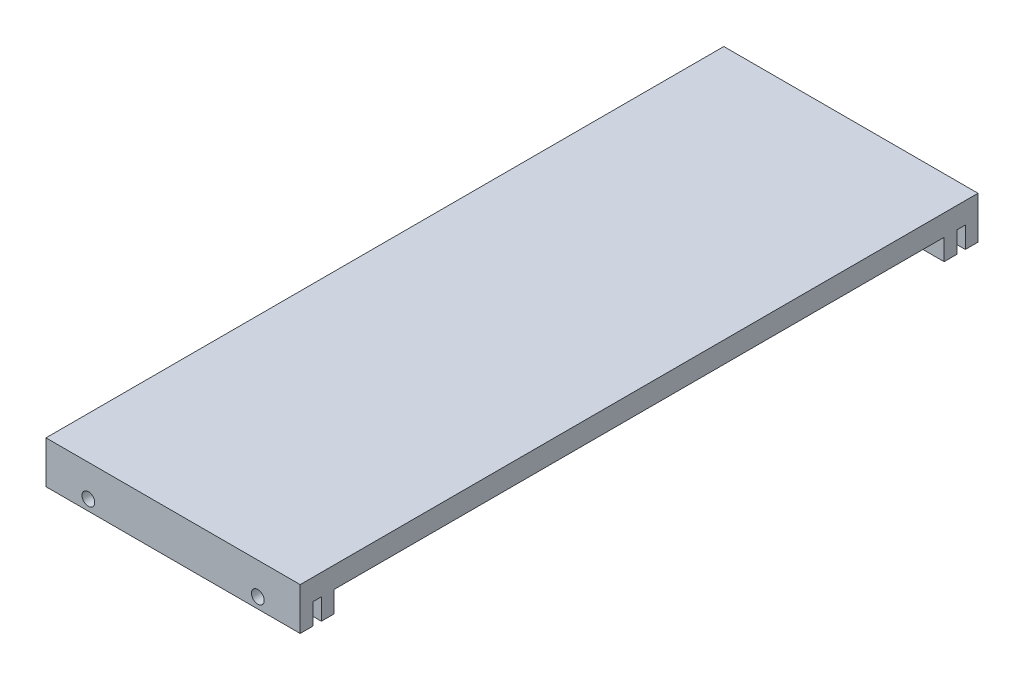
ISO-10303-21;
HEADER;
FILE_DESCRIPTION(('STEP AP214'),'2;1');
FILE_NAME('part.step','',(''),(''),'','','');
FILE_SCHEMA(('AUTOMOTIVE_DESIGN { 1 0 10303 214 1 1 1 1 }'));
ENDSEC;
DATA;
#1=APPLICATION_CONTEXT('core data for automotive mechanical design processes');
#2=APPLICATION_PROTOCOL_DEFINITION('international standard','automotive_design',2000,#1);
#3=PRODUCT_CONTEXT('',#1,'mechanical');
#4=PRODUCT('Part','Part','',(#3));
#5=PRODUCT_RELATED_PRODUCT_CATEGORY('part','',(#4));
#6=PRODUCT_DEFINITION_FORMATION('','',#4);
#7=PRODUCT_DEFINITION_CONTEXT('part definition',#1,'design');
#8=PRODUCT_DEFINITION('design','',#6,#7);
#9=PRODUCT_DEFINITION_SHAPE('','',#8);
#10=(LENGTH_UNIT() NAMED_UNIT(*) SI_UNIT(.MILLI.,.METRE.));
#11=(NAMED_UNIT(*) PLANE_ANGLE_UNIT() SI_UNIT($,.RADIAN.));
#12=(NAMED_UNIT(*) SI_UNIT($,.STERADIAN.) SOLID_ANGLE_UNIT());
#13=UNCERTAINTY_MEASURE_WITH_UNIT(LENGTH_MEASURE(1.E-05),#10,'distance_accuracy_value','');
#14=(GEOMETRIC_REPRESENTATION_CONTEXT(3) GLOBAL_UNCERTAINTY_ASSIGNED_CONTEXT((#13)) GLOBAL_UNIT_ASSIGNED_CONTEXT((#10,
#11,#12)) REPRESENTATION_CONTEXT('',''));
#15=CARTESIAN_POINT('',(0.,0.,0.));
#16=DIRECTION('',(0.,0.,1.));
#17=DIRECTION('',(1.,0.,0.));
#18=AXIS2_PLACEMENT_3D('',#15,#16,#17);
#19=CARTESIAN_POINT('',(300.,-49.9999999999999,-400.));
#20=DIRECTION('',(0.,0.,1.));
#21=DIRECTION('',(1.,0.,0.));
#22=AXIS2_PLACEMENT_3D('',#19,#20,#21);
#23=PLANE('',#22);
#24=CARTESIAN_POINT('',(50.,-37.4999999999999,-400.));
#25=DIRECTION('',(0.,0.,1.));
#26=DIRECTION('',(1.,0.,0.));
#27=AXIS2_PLACEMENT_3D('',#24,#25,#26);
#28=CIRCLE('',#27,7.5);
#29=CARTESIAN_POINT('',(57.5,-37.4999999999999,-400.));
#30=VERTEX_POINT('',#29);
#31=EDGE_CURVE('E249',#30,#30,#28,.T.);
#32=ORIENTED_EDGE('',*,*,#31,.T.);
#33=EDGE_LOOP('',(#32));
#34=FACE_BOUND('',#33,.T.);
#35=CARTESIAN_POINT('',(250.,-37.5,-400.));
#36=DIRECTION('',(0.,0.,1.));
#37=DIRECTION('',(1.,0.,0.));
#38=AXIS2_PLACEMENT_3D('',#35,#36,#37);
#39=CIRCLE('',#38,7.50000000000001);
#40=CARTESIAN_POINT('',(257.5,-37.5,-400.));
#41=VERTEX_POINT('',#40);
#42=EDGE_CURVE('E256',#41,#41,#39,.T.);
#43=ORIENTED_EDGE('',*,*,#42,.T.);
#44=EDGE_LOOP('',(#43));
#45=FACE_BOUND('',#44,.T.);
#46=DIRECTION('',(0.,1.,0.));
#47=VECTOR('',#46,1.);
#48=CARTESIAN_POINT('',(0.,-49.9999999999999,-400.));
#49=LINE('',#48,#47);
#50=CARTESIAN_POINT('',(0.,-49.9999999999999,-400.));
#51=VERTEX_POINT('',#50);
#52=CARTESIAN_POINT('',(0.,0.,-400.));
#53=VERTEX_POINT('',#52);
#54=EDGE_CURVE('E180',#51,#53,#49,.T.);
#55=ORIENTED_EDGE('',*,*,#54,.T.);
#56=DIRECTION('',(-1.,0.,0.));
#57=VECTOR('',#56,1.);
#58=CARTESIAN_POINT('',(300.,0.,-400.));
#59=LINE('',#58,#57);
#60=CARTESIAN_POINT('',(300.,0.,-400.));
#61=VERTEX_POINT('',#60);
#62=EDGE_CURVE('E11',#61,#53,#59,.T.);
#63=ORIENTED_EDGE('',*,*,#62,.F.);
#64=DIRECTION('',(0.,1.,0.));
#65=VECTOR('',#64,1.);
#66=CARTESIAN_POINT('',(300.,-49.9999999999999,-400.));
#67=LINE('',#66,#65);
#68=CARTESIAN_POINT('',(300.,-49.9999999999999,-400.));
#69=VERTEX_POINT('',#68);
#70=EDGE_CURVE('E211',#69,#61,#67,.T.);
#71=ORIENTED_EDGE('',*,*,#70,.F.);
#72=DIRECTION('',(-1.,0.,0.));
#73=VECTOR('',#72,1.);
#74=CARTESIAN_POINT('',(300.,-49.9999999999999,-400.));
#75=LINE('',#74,#73);
#76=EDGE_CURVE('E176',#69,#51,#75,.T.);
#77=ORIENTED_EDGE('',*,*,#76,.T.);
#78=EDGE_LOOP('',(#55,#63,#71,#77));
#79=FACE_BOUND('',#78,.T.);
#80=ADVANCED_FACE('F34',(#34,#45,#79),#23,.F.);
#81=CARTESIAN_POINT('',(300.,0.,400.));
#82=DIRECTION('',(0.,-1.,0.));
#83=DIRECTION('',(0.,0.,-1.));
#84=AXIS2_PLACEMENT_3D('',#81,#82,#83);
#85=PLANE('',#84);
#86=DIRECTION('',(0.,0.,1.));
#87=VECTOR('',#86,1.);
#88=CARTESIAN_POINT('',(0.,0.,400.));
#89=LINE('',#88,#87);
#90=CARTESIAN_POINT('',(0.,0.,400.));
#91=VERTEX_POINT('',#90);
#92=EDGE_CURVE('E183',#53,#91,#89,.T.);
#93=ORIENTED_EDGE('',*,*,#92,.T.);
#94=DIRECTION('',(-1.,0.,0.));
#95=VECTOR('',#94,1.);
#96=CARTESIAN_POINT('',(300.,0.,400.));
#97=LINE('',#96,#95);
#98=CARTESIAN_POINT('',(300.,0.,400.));
#99=VERTEX_POINT('',#98);
#100=EDGE_CURVE('E43',#99,#91,#97,.T.);
#101=ORIENTED_EDGE('',*,*,#100,.F.);
#102=DIRECTION('',(0.,0.,1.));
#103=VECTOR('',#102,1.);
#104=CARTESIAN_POINT('',(300.,0.,400.));
#105=LINE('',#104,#103);
#106=EDGE_CURVE('E119',#61,#99,#105,.T.);
#107=ORIENTED_EDGE('',*,*,#106,.F.);
#108=ORIENTED_EDGE('',*,*,#62,.T.);
#109=EDGE_LOOP('',(#93,#101,#107,#108));
#110=FACE_BOUND('',#109,.T.);
#111=ADVANCED_FACE('F344',(#110),#85,.F.);
#112=CARTESIAN_POINT('',(300.,-50.,400.));
#113=DIRECTION('',(0.,0.,-1.));
#114=DIRECTION('',(-1.,0.,0.));
#115=AXIS2_PLACEMENT_3D('',#112,#113,#114);
#116=PLANE('',#115);
#117=CARTESIAN_POINT('',(50.,-37.4999999999999,400.));
#118=DIRECTION('',(0.,0.,-1.));
#119=DIRECTION('',(-1.,0.,0.));
#120=AXIS2_PLACEMENT_3D('',#117,#118,#119);
#121=CIRCLE('',#120,7.5);
#122=CARTESIAN_POINT('',(42.5,-37.4999999999999,400.));
#123=VERTEX_POINT('',#122);
#124=EDGE_CURVE('E184',#123,#123,#121,.T.);
#125=ORIENTED_EDGE('',*,*,#124,.T.);
#126=EDGE_LOOP('',(#125));
#127=FACE_BOUND('',#126,.T.);
#128=CARTESIAN_POINT('',(250.,-37.5,400.));
#129=DIRECTION('',(0.,0.,-1.));
#130=DIRECTION('',(-1.,0.,0.));
#131=AXIS2_PLACEMENT_3D('',#128,#129,#130);
#132=CIRCLE('',#131,7.50000000000001);
#133=CARTESIAN_POINT('',(242.5,-37.5,400.));
#134=VERTEX_POINT('',#133);
#135=EDGE_CURVE('E274',#134,#134,#132,.T.);
#136=ORIENTED_EDGE('',*,*,#135,.T.);
#137=EDGE_LOOP('',(#136));
#138=FACE_BOUND('',#137,.T.);
#139=DIRECTION('',(0.,-1.,0.));
#140=VECTOR('',#139,1.);
#141=CARTESIAN_POINT('',(0.,-50.,400.));
#142=LINE('',#141,#140);
#143=CARTESIAN_POINT('',(0.,-50.,400.));
#144=VERTEX_POINT('',#143);
#145=EDGE_CURVE('E186',#91,#144,#142,.T.);
#146=ORIENTED_EDGE('',*,*,#145,.T.);
#147=DIRECTION('',(-1.,0.,0.));
#148=VECTOR('',#147,1.);
#149=CARTESIAN_POINT('',(300.,-50.,400.));
#150=LINE('',#149,#148);
#151=CARTESIAN_POINT('',(300.,-50.,400.));
#152=VERTEX_POINT('',#151);
#153=EDGE_CURVE('E242',#152,#144,#150,.T.);
#154=ORIENTED_EDGE('',*,*,#153,.F.);
#155=DIRECTION('',(0.,-1.,0.));
#156=VECTOR('',#155,1.);
#157=CARTESIAN_POINT('',(300.,-50.,400.));
#158=LINE('',#157,#156);
#159=EDGE_CURVE('E296',#99,#152,#158,.T.);
#160=ORIENTED_EDGE('',*,*,#159,.F.);
#161=ORIENTED_EDGE('',*,*,#100,.T.);
#162=EDGE_LOOP('',(#146,#154,#160,#161));
#163=FACE_BOUND('',#162,.T.);
#164=ADVANCED_FACE('F348',(#127,#138,#163),#116,.F.);
#165=CARTESIAN_POINT('',(300.,-50.,385.));
#166=DIRECTION('',(0.,1.,0.));
#167=DIRECTION('',(0.,0.,1.));
#168=AXIS2_PLACEMENT_3D('',#165,#166,#167);
#169=PLANE('',#168);
#170=DIRECTION('',(0.,0.,-1.));
#171=VECTOR('',#170,1.);
#172=CARTESIAN_POINT('',(0.,-50.,385.));
#173=LINE('',#172,#171);
#174=CARTESIAN_POINT('',(0.,-50.,385.));
#175=VERTEX_POINT('',#174);
#176=EDGE_CURVE('E188',#144,#175,#173,.T.);
#177=ORIENTED_EDGE('',*,*,#176,.T.);
#178=DIRECTION('',(-1.,0.,0.));
#179=VECTOR('',#178,1.);
#180=CARTESIAN_POINT('',(300.,-50.,385.));
#181=LINE('',#180,#179);
#182=CARTESIAN_POINT('',(300.,-50.,385.));
#183=VERTEX_POINT('',#182);
#184=EDGE_CURVE('E239',#183,#175,#181,.T.);
#185=ORIENTED_EDGE('',*,*,#184,.F.);
#186=DIRECTION('',(0.,0.,-1.));
#187=VECTOR('',#186,1.);
#188=CARTESIAN_POINT('',(300.,-50.,385.));
#189=LINE('',#188,#187);
#190=EDGE_CURVE('E298',#152,#183,#189,.T.);
#191=ORIENTED_EDGE('',*,*,#190,.F.);
#192=ORIENTED_EDGE('',*,*,#153,.T.);
#193=EDGE_LOOP('',(#177,#185,#191,#192));
#194=FACE_BOUND('',#193,.T.);
#195=ADVANCED_FACE('F427',(#194),#169,.F.);
#196=CARTESIAN_POINT('',(300.,-50.,385.));
#197=DIRECTION('',(0.,0.,1.));
#198=DIRECTION('',(0.,-1.,0.));
#199=AXIS2_PLACEMENT_3D('',#196,#197,#198);
#200=PLANE('',#199);
#201=CARTESIAN_POINT('',(50.,-37.4999999999999,385.));
#202=DIRECTION('',(0.,0.,1.));
#203=DIRECTION('',(0.,-1.,0.));
#204=AXIS2_PLACEMENT_3D('',#201,#202,#203);
#205=CIRCLE('',#204,7.5);
#206=CARTESIAN_POINT('',(50.,-44.9999999999999,385.));
#207=VERTEX_POINT('',#206);
#208=EDGE_CURVE('E289',#207,#207,#205,.T.);
#209=ORIENTED_EDGE('',*,*,#208,.T.);
#210=EDGE_LOOP('',(#209));
#211=FACE_BOUND('',#210,.T.);
#212=CARTESIAN_POINT('',(250.,-37.5,385.));
#213=DIRECTION('',(0.,0.,1.));
#214=DIRECTION('',(0.,-1.,0.));
#215=AXIS2_PLACEMENT_3D('',#212,#213,#214);
#216=CIRCLE('',#215,7.50000000000001);
#217=CARTESIAN_POINT('',(250.,-45.,385.));
#218=VERTEX_POINT('',#217);
#219=EDGE_CURVE('E271',#218,#218,#216,.T.);
#220=ORIENTED_EDGE('',*,*,#219,.T.);
#221=EDGE_LOOP('',(#220));
#222=FACE_BOUND('',#221,.T.);
#223=DIRECTION('',(0.,1.,0.));
#224=VECTOR('',#223,1.);
#225=CARTESIAN_POINT('',(0.,-50.,385.));
#226=LINE('',#225,#224);
#227=CARTESIAN_POINT('',(0.,-25.,385.));
#228=VERTEX_POINT('',#227);
#229=EDGE_CURVE('E190',#175,#228,#226,.T.);
#230=ORIENTED_EDGE('',*,*,#229,.T.);
#231=DIRECTION('',(-1.,0.,0.));
#232=VECTOR('',#231,1.);
#233=CARTESIAN_POINT('',(300.,-25.,385.));
#234=LINE('',#233,#232);
#235=CARTESIAN_POINT('',(300.,-25.,385.));
#236=VERTEX_POINT('',#235);
#237=EDGE_CURVE('E236',#236,#228,#234,.T.);
#238=ORIENTED_EDGE('',*,*,#237,.F.);
#239=DIRECTION('',(0.,1.,0.));
#240=VECTOR('',#239,1.);
#241=CARTESIAN_POINT('',(300.,-50.,385.));
#242=LINE('',#241,#240);
#243=EDGE_CURVE('E300',#183,#236,#242,.T.);
#244=ORIENTED_EDGE('',*,*,#243,.F.);
#245=ORIENTED_EDGE('',*,*,#184,.T.);
#246=EDGE_LOOP('',(#230,#238,#244,#245));
#247=FACE_BOUND('',#246,.T.);
#248=ADVANCED_FACE('F423',(#211,#222,#247),#200,.F.);
#249=CARTESIAN_POINT('',(300.,-25.,385.));
#250=DIRECTION('',(0.,1.,0.));
#251=DIRECTION('',(0.,0.,1.));
#252=AXIS2_PLACEMENT_3D('',#249,#250,#251);
#253=PLANE('',#252);
#254=DIRECTION('',(0.,0.,-1.));
#255=VECTOR('',#254,1.);
#256=CARTESIAN_POINT('',(0.,-25.,385.));
#257=LINE('',#256,#255);
#258=CARTESIAN_POINT('',(0.,-25.,375.));
#259=VERTEX_POINT('',#258);
#260=EDGE_CURVE('E192',#228,#259,#257,.T.);
#261=ORIENTED_EDGE('',*,*,#260,.T.);
#262=DIRECTION('',(-1.,0.,0.));
#263=VECTOR('',#262,1.);
#264=CARTESIAN_POINT('',(300.,-25.,375.));
#265=LINE('',#264,#263);
#266=CARTESIAN_POINT('',(300.,-25.,375.));
#267=VERTEX_POINT('',#266);
#268=EDGE_CURVE('E233',#267,#259,#265,.T.);
#269=ORIENTED_EDGE('',*,*,#268,.F.);
#270=DIRECTION('',(0.,0.,-1.));
#271=VECTOR('',#270,1.);
#272=CARTESIAN_POINT('',(300.,-25.,385.));
#273=LINE('',#272,#271);
#274=EDGE_CURVE('E302',#236,#267,#273,.T.);
#275=ORIENTED_EDGE('',*,*,#274,.F.);
#276=ORIENTED_EDGE('',*,*,#237,.T.);
#277=EDGE_LOOP('',(#261,#269,#275,#276));
#278=FACE_BOUND('',#277,.T.);
#279=ADVANCED_FACE('F393',(#278),#253,.F.);
#280=CARTESIAN_POINT('',(300.,-25.,375.));
#281=DIRECTION('',(0.,0.,-1.));
#282=DIRECTION('',(0.,1.,0.));
#283=AXIS2_PLACEMENT_3D('',#280,#281,#282);
#284=PLANE('',#283);
#285=CARTESIAN_POINT('',(50.,-37.4999999999999,375.));
#286=DIRECTION('',(0.,0.,-1.));
#287=DIRECTION('',(0.,1.,0.));
#288=AXIS2_PLACEMENT_3D('',#285,#286,#287);
#289=CIRCLE('',#288,7.5);
#290=CARTESIAN_POINT('',(50.,-29.9999999999999,375.));
#291=VERTEX_POINT('',#290);
#292=EDGE_CURVE('E286',#291,#291,#289,.T.);
#293=ORIENTED_EDGE('',*,*,#292,.T.);
#294=EDGE_LOOP('',(#293));
#295=FACE_BOUND('',#294,.T.);
#296=CARTESIAN_POINT('',(250.,-37.5,375.));
#297=DIRECTION('',(0.,0.,-1.));
#298=DIRECTION('',(0.,1.,0.));
#299=AXIS2_PLACEMENT_3D('',#296,#297,#298);
#300=CIRCLE('',#299,7.50000000000001);
#301=CARTESIAN_POINT('',(250.,-30.,375.));
#302=VERTEX_POINT('',#301);
#303=EDGE_CURVE('E268',#302,#302,#300,.T.);
#304=ORIENTED_EDGE('',*,*,#303,.T.);
#305=EDGE_LOOP('',(#304));
#306=FACE_BOUND('',#305,.T.);
#307=DIRECTION('',(0.,-1.,0.));
#308=VECTOR('',#307,1.);
#309=CARTESIAN_POINT('',(0.,-25.,375.));
#310=LINE('',#309,#308);
#311=CARTESIAN_POINT('',(0.,-50.,375.));
#312=VERTEX_POINT('',#311);
#313=EDGE_CURVE('E194',#259,#312,#310,.T.);
#314=ORIENTED_EDGE('',*,*,#313,.T.);
#315=DIRECTION('',(-1.,0.,0.));
#316=VECTOR('',#315,1.);
#317=CARTESIAN_POINT('',(300.,-50.,375.));
#318=LINE('',#317,#316);
#319=CARTESIAN_POINT('',(300.,-50.,375.));
#320=VERTEX_POINT('',#319);
#321=EDGE_CURVE('E230',#320,#312,#318,.T.);
#322=ORIENTED_EDGE('',*,*,#321,.F.);
#323=DIRECTION('',(0.,-1.,0.));
#324=VECTOR('',#323,1.);
#325=CARTESIAN_POINT('',(300.,-25.,375.));
#326=LINE('',#325,#324);
#327=EDGE_CURVE('E304',#267,#320,#326,.T.);
#328=ORIENTED_EDGE('',*,*,#327,.F.);
#329=ORIENTED_EDGE('',*,*,#268,.T.);
#330=EDGE_LOOP('',(#314,#322,#328,#329));
#331=FACE_BOUND('',#330,.T.);
#332=ADVANCED_FACE('F389',(#295,#306,#331),#284,.F.);
#333=CARTESIAN_POINT('',(300.,-50.,375.));
#334=DIRECTION('',(0.,1.,0.));
#335=DIRECTION('',(0.,0.,1.));
#336=AXIS2_PLACEMENT_3D('',#333,#334,#335);
#337=PLANE('',#336);
#338=DIRECTION('',(0.,0.,-1.));
#339=VECTOR('',#338,1.);
#340=CARTESIAN_POINT('',(0.,-50.,375.));
#341=LINE('',#340,#339);
#342=CARTESIAN_POINT('',(0.,-50.,360.));
#343=VERTEX_POINT('',#342);
#344=EDGE_CURVE('E196',#312,#343,#341,.T.);
#345=ORIENTED_EDGE('',*,*,#344,.T.);
#346=DIRECTION('',(-1.,0.,0.));
#347=VECTOR('',#346,1.);
#348=CARTESIAN_POINT('',(300.,-50.,360.));
#349=LINE('',#348,#347);
#350=CARTESIAN_POINT('',(300.,-50.,360.));
#351=VERTEX_POINT('',#350);
#352=EDGE_CURVE('E227',#351,#343,#349,.T.);
#353=ORIENTED_EDGE('',*,*,#352,.F.);
#354=DIRECTION('',(0.,0.,-1.));
#355=VECTOR('',#354,1.);
#356=CARTESIAN_POINT('',(300.,-50.,375.));
#357=LINE('',#356,#355);
#358=EDGE_CURVE('E306',#320,#351,#357,.T.);
#359=ORIENTED_EDGE('',*,*,#358,.F.);
#360=ORIENTED_EDGE('',*,*,#321,.T.);
#361=EDGE_LOOP('',(#345,#353,#359,#360));
#362=FACE_BOUND('',#361,.T.);
#363=ADVANCED_FACE('F392',(#362),#337,.F.);
#364=CARTESIAN_POINT('',(300.,-50.,360.));
#365=DIRECTION('',(0.,0.,1.));
#366=DIRECTION('',(1.,0.,0.));
#367=AXIS2_PLACEMENT_3D('',#364,#365,#366);
#368=PLANE('',#367);
#369=CARTESIAN_POINT('',(50.,-37.4999999999999,360.));
#370=DIRECTION('',(0.,0.,1.));
#371=DIRECTION('',(1.,0.,0.));
#372=AXIS2_PLACEMENT_3D('',#369,#370,#371);
#373=CIRCLE('',#372,7.5);
#374=CARTESIAN_POINT('',(57.5,-37.4999999999999,360.));
#375=VERTEX_POINT('',#374);
#376=EDGE_CURVE('E283',#375,#375,#373,.T.);
#377=ORIENTED_EDGE('',*,*,#376,.T.);
#378=EDGE_LOOP('',(#377));
#379=FACE_BOUND('',#378,.T.);
#380=CARTESIAN_POINT('',(250.,-37.5,360.));
#381=DIRECTION('',(0.,0.,1.));
#382=DIRECTION('',(1.,0.,0.));
#383=AXIS2_PLACEMENT_3D('',#380,#381,#382);
#384=CIRCLE('',#383,7.50000000000001);
#385=CARTESIAN_POINT('',(257.5,-37.5,360.));
#386=VERTEX_POINT('',#385);
#387=EDGE_CURVE('E265',#386,#386,#384,.T.);
#388=ORIENTED_EDGE('',*,*,#387,.T.);
#389=EDGE_LOOP('',(#388));
#390=FACE_BOUND('',#389,.T.);
#391=DIRECTION('',(0.,1.,0.));
#392=VECTOR('',#391,1.);
#393=CARTESIAN_POINT('',(0.,-50.,360.));
#394=LINE('',#393,#392);
#395=CARTESIAN_POINT('',(0.,-25.,360.));
#396=VERTEX_POINT('',#395);
#397=EDGE_CURVE('E198',#343,#396,#394,.T.);
#398=ORIENTED_EDGE('',*,*,#397,.T.);
#399=DIRECTION('',(-1.,0.,0.));
#400=VECTOR('',#399,1.);
#401=CARTESIAN_POINT('',(300.,-25.,360.));
#402=LINE('',#401,#400);
#403=CARTESIAN_POINT('',(300.,-25.,360.));
#404=VERTEX_POINT('',#403);
#405=EDGE_CURVE('E224',#404,#396,#402,.T.);
#406=ORIENTED_EDGE('',*,*,#405,.F.);
#407=DIRECTION('',(0.,1.,0.));
#408=VECTOR('',#407,1.);
#409=CARTESIAN_POINT('',(300.,-50.,360.));
#410=LINE('',#409,#408);
#411=EDGE_CURVE('E308',#351,#404,#410,.T.);
#412=ORIENTED_EDGE('',*,*,#411,.F.);
#413=ORIENTED_EDGE('',*,*,#352,.T.);
#414=EDGE_LOOP('',(#398,#406,#412,#413));
#415=FACE_BOUND('',#414,.T.);
#416=ADVANCED_FACE('F410',(#379,#390,#415),#368,.F.);
#417=CARTESIAN_POINT('',(300.,-25.,360.));
#418=DIRECTION('',(0.,1.,0.));
#419=DIRECTION('',(0.,0.,1.));
#420=AXIS2_PLACEMENT_3D('',#417,#418,#419);
#421=PLANE('',#420);
#422=DIRECTION('',(0.,0.,-1.));
#423=VECTOR('',#422,1.);
#424=CARTESIAN_POINT('',(0.,-25.,360.));
#425=LINE('',#424,#423);
#426=CARTESIAN_POINT('',(0.,-25.,-360.));
#427=VERTEX_POINT('',#426);
#428=EDGE_CURVE('E200',#396,#427,#425,.T.);
#429=ORIENTED_EDGE('',*,*,#428,.T.);
#430=DIRECTION('',(-1.,0.,0.));
#431=VECTOR('',#430,1.);
#432=CARTESIAN_POINT('',(300.,-25.,-360.));
#433=LINE('',#432,#431);
#434=CARTESIAN_POINT('',(300.,-25.,-360.));
#435=VERTEX_POINT('',#434);
#436=EDGE_CURVE('E221',#435,#427,#433,.T.);
#437=ORIENTED_EDGE('',*,*,#436,.F.);
#438=DIRECTION('',(0.,0.,-1.));
#439=VECTOR('',#438,1.);
#440=CARTESIAN_POINT('',(300.,-25.,360.));
#441=LINE('',#440,#439);
#442=EDGE_CURVE('E310',#404,#435,#441,.T.);
#443=ORIENTED_EDGE('',*,*,#442,.F.);
#444=ORIENTED_EDGE('',*,*,#405,.T.);
#445=EDGE_LOOP('',(#429,#437,#443,#444));
#446=FACE_BOUND('',#445,.T.);
#447=ADVANCED_FACE('F414',(#446),#421,.F.);
#448=CARTESIAN_POINT('',(300.,-25.,-360.));
#449=DIRECTION('',(0.,0.,-1.));
#450=DIRECTION('',(-1.,0.,0.));
#451=AXIS2_PLACEMENT_3D('',#448,#449,#450);
#452=PLANE('',#451);
#453=CARTESIAN_POINT('',(50.,-37.4999999999999,-360.));
#454=DIRECTION('',(0.,0.,-1.));
#455=DIRECTION('',(-1.,0.,0.));
#456=AXIS2_PLACEMENT_3D('',#453,#454,#455);
#457=CIRCLE('',#456,7.5);
#458=CARTESIAN_POINT('',(42.5,-37.4999999999999,-360.));
#459=VERTEX_POINT('',#458);
#460=EDGE_CURVE('E280',#459,#459,#457,.T.);
#461=ORIENTED_EDGE('',*,*,#460,.T.);
#462=EDGE_LOOP('',(#461));
#463=FACE_BOUND('',#462,.T.);
#464=CARTESIAN_POINT('',(250.,-37.5,-360.));
#465=DIRECTION('',(0.,0.,-1.));
#466=DIRECTION('',(-1.,0.,0.));
#467=AXIS2_PLACEMENT_3D('',#464,#465,#466);
#468=CIRCLE('',#467,7.50000000000001);
#469=CARTESIAN_POINT('',(242.5,-37.5,-360.));
#470=VERTEX_POINT('',#469);
#471=EDGE_CURVE('E253',#470,#470,#468,.T.);
#472=ORIENTED_EDGE('',*,*,#471,.T.);
#473=EDGE_LOOP('',(#472));
#474=FACE_BOUND('',#473,.T.);
#475=DIRECTION('',(0.,-1.,0.));
#476=VECTOR('',#475,1.);
#477=CARTESIAN_POINT('',(0.,-25.,-360.));
#478=LINE('',#477,#476);
#479=CARTESIAN_POINT('',(0.,-50.,-360.));
#480=VERTEX_POINT('',#479);
#481=EDGE_CURVE('E202',#427,#480,#478,.T.);
#482=ORIENTED_EDGE('',*,*,#481,.T.);
#483=DIRECTION('',(-1.,0.,0.));
#484=VECTOR('',#483,1.);
#485=CARTESIAN_POINT('',(300.,-50.,-360.));
#486=LINE('',#485,#484);
#487=CARTESIAN_POINT('',(300.,-50.,-360.));
#488=VERTEX_POINT('',#487);
#489=EDGE_CURVE('E218',#488,#480,#486,.T.);
#490=ORIENTED_EDGE('',*,*,#489,.F.);
#491=DIRECTION('',(0.,-1.,0.));
#492=VECTOR('',#491,1.);
#493=CARTESIAN_POINT('',(300.,-25.,-360.));
#494=LINE('',#493,#492);
#495=EDGE_CURVE('E312',#435,#488,#494,.T.);
#496=ORIENTED_EDGE('',*,*,#495,.F.);
#497=ORIENTED_EDGE('',*,*,#436,.T.);
#498=EDGE_LOOP('',(#482,#490,#496,#497));
#499=FACE_BOUND('',#498,.T.);
#500=ADVANCED_FACE('F452',(#463,#474,#499),#452,.F.);
#501=CARTESIAN_POINT('',(300.,-50.,-360.));
#502=DIRECTION('',(0.,1.,0.));
#503=DIRECTION('',(0.,0.,1.));
#504=AXIS2_PLACEMENT_3D('',#501,#502,#503);
#505=PLANE('',#504);
#506=DIRECTION('',(0.,0.,-1.));
#507=VECTOR('',#506,1.);
#508=CARTESIAN_POINT('',(0.,-50.,-360.));
#509=LINE('',#508,#507);
#510=CARTESIAN_POINT('',(0.,-50.,-375.));
#511=VERTEX_POINT('',#510);
#512=EDGE_CURVE('E204',#480,#511,#509,.T.);
#513=ORIENTED_EDGE('',*,*,#512,.T.);
#514=DIRECTION('',(-1.,0.,0.));
#515=VECTOR('',#514,1.);
#516=CARTESIAN_POINT('',(300.,-50.,-375.));
#517=LINE('',#516,#515);
#518=CARTESIAN_POINT('',(300.,-50.,-375.));
#519=VERTEX_POINT('',#518);
#520=EDGE_CURVE('E215',#519,#511,#517,.T.);
#521=ORIENTED_EDGE('',*,*,#520,.F.);
#522=DIRECTION('',(0.,0.,-1.));
#523=VECTOR('',#522,1.);
#524=CARTESIAN_POINT('',(300.,-50.,-360.));
#525=LINE('',#524,#523);
#526=EDGE_CURVE('E314',#488,#519,#525,.T.);
#527=ORIENTED_EDGE('',*,*,#526,.F.);
#528=ORIENTED_EDGE('',*,*,#489,.T.);
#529=EDGE_LOOP('',(#513,#521,#527,#528));
#530=FACE_BOUND('',#529,.T.);
#531=ADVANCED_FACE('F320',(#530),#505,.F.);
#532=CARTESIAN_POINT('',(300.,-50.,-375.));
#533=DIRECTION('',(0.,0.,1.));
#534=DIRECTION('',(0.,-1.,0.));
#535=AXIS2_PLACEMENT_3D('',#532,#533,#534);
#536=PLANE('',#535);
#537=CARTESIAN_POINT('',(50.,-37.4999999999999,-375.));
#538=DIRECTION('',(0.,0.,1.));
#539=DIRECTION('',(0.,-1.,0.));
#540=AXIS2_PLACEMENT_3D('',#537,#538,#539);
#541=CIRCLE('',#540,7.5);
#542=CARTESIAN_POINT('',(50.,-44.9999999999999,-375.));
#543=VERTEX_POINT('',#542);
#544=EDGE_CURVE('E277',#543,#543,#541,.T.);
#545=ORIENTED_EDGE('',*,*,#544,.T.);
#546=EDGE_LOOP('',(#545));
#547=FACE_BOUND('',#546,.T.);
#548=CARTESIAN_POINT('',(250.,-37.5,-375.));
#549=DIRECTION('',(0.,0.,1.));
#550=DIRECTION('',(0.,-1.,0.));
#551=AXIS2_PLACEMENT_3D('',#548,#549,#550);
#552=CIRCLE('',#551,7.50000000000001);
#553=CARTESIAN_POINT('',(250.,-45.,-375.));
#554=VERTEX_POINT('',#553);
#555=EDGE_CURVE('E248',#554,#554,#552,.T.);
#556=ORIENTED_EDGE('',*,*,#555,.T.);
#557=EDGE_LOOP('',(#556));
#558=FACE_BOUND('',#557,.T.);
#559=DIRECTION('',(0.,1.,0.));
#560=VECTOR('',#559,1.);
#561=CARTESIAN_POINT('',(0.,-50.,-375.));
#562=LINE('',#561,#560);
#563=CARTESIAN_POINT('',(0.,-25.,-375.));
#564=VERTEX_POINT('',#563);
#565=EDGE_CURVE('E206',#511,#564,#562,.T.);
#566=ORIENTED_EDGE('',*,*,#565,.T.);
#567=DIRECTION('',(-1.,0.,0.));
#568=VECTOR('',#567,1.);
#569=CARTESIAN_POINT('',(300.,-25.,-375.));
#570=LINE('',#569,#568);
#571=CARTESIAN_POINT('',(300.,-25.,-375.));
#572=VERTEX_POINT('',#571);
#573=EDGE_CURVE('E171',#572,#564,#570,.T.);
#574=ORIENTED_EDGE('',*,*,#573,.F.);
#575=DIRECTION('',(0.,1.,0.));
#576=VECTOR('',#575,1.);
#577=CARTESIAN_POINT('',(300.,-50.,-375.));
#578=LINE('',#577,#576);
#579=EDGE_CURVE('E162',#519,#572,#578,.T.);
#580=ORIENTED_EDGE('',*,*,#579,.F.);
#581=ORIENTED_EDGE('',*,*,#520,.T.);
#582=EDGE_LOOP('',(#566,#574,#580,#581));
#583=FACE_BOUND('',#582,.T.);
#584=ADVANCED_FACE('F324',(#547,#558,#583),#536,.F.);
#585=CARTESIAN_POINT('',(300.,-25.,-375.));
#586=DIRECTION('',(0.,1.,0.));
#587=DIRECTION('',(0.,0.,1.));
#588=AXIS2_PLACEMENT_3D('',#585,#586,#587);
#589=PLANE('',#588);
#590=DIRECTION('',(0.,0.,-1.));
#591=VECTOR('',#590,1.);
#592=CARTESIAN_POINT('',(0.,-25.,-375.));
#593=LINE('',#592,#591);
#594=CARTESIAN_POINT('',(0.,-25.,-385.));
#595=VERTEX_POINT('',#594);
#596=EDGE_CURVE('E170',#564,#595,#593,.T.);
#597=ORIENTED_EDGE('',*,*,#596,.T.);
#598=DIRECTION('',(-1.,0.,0.));
#599=VECTOR('',#598,1.);
#600=CARTESIAN_POINT('',(300.,-25.,-385.));
#601=LINE('',#600,#599);
#602=CARTESIAN_POINT('',(300.,-25.,-385.));
#603=VERTEX_POINT('',#602);
#604=EDGE_CURVE('E167',#603,#595,#601,.T.);
#605=ORIENTED_EDGE('',*,*,#604,.F.);
#606=DIRECTION('',(0.,0.,-1.));
#607=VECTOR('',#606,1.);
#608=CARTESIAN_POINT('',(300.,-25.,-375.));
#609=LINE('',#608,#607);
#610=EDGE_CURVE('E156',#572,#603,#609,.T.);
#611=ORIENTED_EDGE('',*,*,#610,.F.);
#612=ORIENTED_EDGE('',*,*,#573,.T.);
#613=EDGE_LOOP('',(#597,#605,#611,#612));
#614=FACE_BOUND('',#613,.T.);
#615=ADVANCED_FACE('F168',(#614),#589,.F.);
#616=CARTESIAN_POINT('',(300.,-25.,-385.));
#617=DIRECTION('',(0.,0.,-1.));
#618=DIRECTION('',(0.,1.,0.));
#619=AXIS2_PLACEMENT_3D('',#616,#617,#618);
#620=PLANE('',#619);
#621=CARTESIAN_POINT('',(50.,-37.4999999999999,-385.));
#622=DIRECTION('',(0.,0.,-1.));
#623=DIRECTION('',(0.,1.,0.));
#624=AXIS2_PLACEMENT_3D('',#621,#622,#623);
#625=CIRCLE('',#624,7.5);
#626=CARTESIAN_POINT('',(50.,-29.9999999999999,-385.));
#627=VERTEX_POINT('',#626);
#628=EDGE_CURVE('E37',#627,#627,#625,.T.);
#629=ORIENTED_EDGE('',*,*,#628,.T.);
#630=EDGE_LOOP('',(#629));
#631=FACE_BOUND('',#630,.T.);
#632=CARTESIAN_POINT('',(250.,-37.5,-385.));
#633=DIRECTION('',(0.,0.,-1.));
#634=DIRECTION('',(0.,1.,0.));
#635=AXIS2_PLACEMENT_3D('',#632,#633,#634);
#636=CIRCLE('',#635,7.50000000000001);
#637=CARTESIAN_POINT('',(250.,-30.,-385.));
#638=VERTEX_POINT('',#637);
#639=EDGE_CURVE('E246',#638,#638,#636,.T.);
#640=ORIENTED_EDGE('',*,*,#639,.T.);
#641=EDGE_LOOP('',(#640));
#642=FACE_BOUND('',#641,.T.);
#643=DIRECTION('',(0.,-1.,0.));
#644=VECTOR('',#643,1.);
#645=CARTESIAN_POINT('',(0.,-25.,-385.));
#646=LINE('',#645,#644);
#647=CARTESIAN_POINT('',(0.,-50.,-385.));
#648=VERTEX_POINT('',#647);
#649=EDGE_CURVE('E105',#595,#648,#646,.T.);
#650=ORIENTED_EDGE('',*,*,#649,.T.);
#651=DIRECTION('',(-1.,0.,0.));
#652=VECTOR('',#651,1.);
#653=CARTESIAN_POINT('',(300.,-50.,-385.));
#654=LINE('',#653,#652);
#655=CARTESIAN_POINT('',(300.,-50.,-385.));
#656=VERTEX_POINT('',#655);
#657=EDGE_CURVE('E172',#656,#648,#654,.T.);
#658=ORIENTED_EDGE('',*,*,#657,.F.);
#659=DIRECTION('',(0.,-1.,0.));
#660=VECTOR('',#659,1.);
#661=CARTESIAN_POINT('',(300.,-25.,-385.));
#662=LINE('',#661,#660);
#663=EDGE_CURVE('E160',#603,#656,#662,.T.);
#664=ORIENTED_EDGE('',*,*,#663,.F.);
#665=ORIENTED_EDGE('',*,*,#604,.T.);
#666=EDGE_LOOP('',(#650,#658,#664,#665));
#667=FACE_BOUND('',#666,.T.);
#668=ADVANCED_FACE('F174',(#631,#642,#667),#620,.F.);
#669=CARTESIAN_POINT('',(300.,-50.,-385.));
#670=DIRECTION('',(0.,1.,0.));
#671=DIRECTION('',(0.,0.,1.));
#672=AXIS2_PLACEMENT_3D('',#669,#670,#671);
#673=PLANE('',#672);
#674=DIRECTION('',(0.,0.,-1.));
#675=VECTOR('',#674,1.);
#676=CARTESIAN_POINT('',(0.,-50.,-385.));
#677=LINE('',#676,#675);
#678=EDGE_CURVE('E111',#648,#51,#677,.T.);
#679=ORIENTED_EDGE('',*,*,#678,.T.);
#680=ORIENTED_EDGE('',*,*,#76,.F.);
#681=DIRECTION('',(0.,0.,-1.));
#682=VECTOR('',#681,1.);
#683=CARTESIAN_POINT('',(300.,-50.,-385.));
#684=LINE('',#683,#682);
#685=EDGE_CURVE('E52',#656,#69,#684,.T.);
#686=ORIENTED_EDGE('',*,*,#685,.F.);
#687=ORIENTED_EDGE('',*,*,#657,.T.);
#688=EDGE_LOOP('',(#679,#680,#686,#687));
#689=FACE_BOUND('',#688,.T.);
#690=ADVANCED_FACE('F332',(#689),#673,.F.);
#691=CARTESIAN_POINT('',(300.,0.,0.));
#692=DIRECTION('',(-1.,0.,0.));
#693=DIRECTION('',(0.,0.,1.));
#694=AXIS2_PLACEMENT_3D('',#691,#692,#693);
#695=PLANE('',#694);
#696=ORIENTED_EDGE('',*,*,#70,.T.);
#697=ORIENTED_EDGE('',*,*,#106,.T.);
#698=ORIENTED_EDGE('',*,*,#159,.T.);
#699=ORIENTED_EDGE('',*,*,#190,.T.);
#700=ORIENTED_EDGE('',*,*,#243,.T.);
#701=ORIENTED_EDGE('',*,*,#274,.T.);
#702=ORIENTED_EDGE('',*,*,#327,.T.);
#703=ORIENTED_EDGE('',*,*,#358,.T.);
#704=ORIENTED_EDGE('',*,*,#411,.T.);
#705=ORIENTED_EDGE('',*,*,#442,.T.);
#706=ORIENTED_EDGE('',*,*,#495,.T.);
#707=ORIENTED_EDGE('',*,*,#526,.T.);
#708=ORIENTED_EDGE('',*,*,#579,.T.);
#709=ORIENTED_EDGE('',*,*,#610,.T.);
#710=ORIENTED_EDGE('',*,*,#663,.T.);
#711=ORIENTED_EDGE('',*,*,#685,.T.);
#712=EDGE_LOOP('',(#696,#697,#698,#699,#700,#701,#702,#703,#704,#705,#706,#707,#708,#709,#710,#711));
#713=FACE_BOUND('',#712,.T.);
#714=ADVANCED_FACE('F158',(#713),#695,.F.);
#715=CARTESIAN_POINT('',(0.,0.,0.));
#716=DIRECTION('',(-1.,0.,0.));
#717=DIRECTION('',(0.,0.,1.));
#718=AXIS2_PLACEMENT_3D('',#715,#716,#717);
#719=PLANE('',#718);
#720=ORIENTED_EDGE('',*,*,#54,.F.);
#721=ORIENTED_EDGE('',*,*,#678,.F.);
#722=ORIENTED_EDGE('',*,*,#649,.F.);
#723=ORIENTED_EDGE('',*,*,#596,.F.);
#724=ORIENTED_EDGE('',*,*,#565,.F.);
#725=ORIENTED_EDGE('',*,*,#512,.F.);
#726=ORIENTED_EDGE('',*,*,#481,.F.);
#727=ORIENTED_EDGE('',*,*,#428,.F.);
#728=ORIENTED_EDGE('',*,*,#397,.F.);
#729=ORIENTED_EDGE('',*,*,#344,.F.);
#730=ORIENTED_EDGE('',*,*,#313,.F.);
#731=ORIENTED_EDGE('',*,*,#260,.F.);
#732=ORIENTED_EDGE('',*,*,#229,.F.);
#733=ORIENTED_EDGE('',*,*,#176,.F.);
#734=ORIENTED_EDGE('',*,*,#145,.F.);
#735=ORIENTED_EDGE('',*,*,#92,.F.);
#736=EDGE_LOOP('',(#720,#721,#722,#723,#724,#725,#726,#727,#728,#729,#730,#731,#732,#733,#734,#735));
#737=FACE_BOUND('',#736,.T.);
#738=ADVANCED_FACE('F327',(#737),#719,.T.);
#739=CARTESIAN_POINT('',(250.,-37.5,-400.));
#740=DIRECTION('',(0.,0.,1.));
#741=DIRECTION('',(1.,0.,0.));
#742=AXIS2_PLACEMENT_3D('',#739,#740,#741);
#743=CYLINDRICAL_SURFACE('',#742,7.50000000000001);
#744=ORIENTED_EDGE('',*,*,#42,.F.);
#745=EDGE_LOOP('',(#744));
#746=FACE_BOUND('',#745,.T.);
#747=ORIENTED_EDGE('',*,*,#639,.F.);
#748=EDGE_LOOP('',(#747));
#749=FACE_BOUND('',#748,.T.);
#750=ADVANCED_FACE('F352',(#746,#749),#743,.F.);
#751=CARTESIAN_POINT('',(50.,-37.4999999999999,-400.));
#752=DIRECTION('',(0.,0.,1.));
#753=DIRECTION('',(1.,0.,0.));
#754=AXIS2_PLACEMENT_3D('',#751,#752,#753);
#755=CYLINDRICAL_SURFACE('',#754,7.5);
#756=ORIENTED_EDGE('',*,*,#31,.F.);
#757=EDGE_LOOP('',(#756));
#758=FACE_BOUND('',#757,.T.);
#759=ORIENTED_EDGE('',*,*,#628,.F.);
#760=EDGE_LOOP('',(#759));
#761=FACE_BOUND('',#760,.T.);
#762=ADVANCED_FACE('F355',(#758,#761),#755,.F.);
#763=ORIENTED_EDGE('',*,*,#555,.F.);
#764=EDGE_LOOP('',(#763));
#765=FACE_BOUND('',#764,.T.);
#766=ORIENTED_EDGE('',*,*,#471,.F.);
#767=EDGE_LOOP('',(#766));
#768=FACE_BOUND('',#767,.T.);
#769=ADVANCED_FACE('F358',(#765,#768),#743,.F.);
#770=ORIENTED_EDGE('',*,*,#544,.F.);
#771=EDGE_LOOP('',(#770));
#772=FACE_BOUND('',#771,.T.);
#773=ORIENTED_EDGE('',*,*,#460,.F.);
#774=EDGE_LOOP('',(#773));
#775=FACE_BOUND('',#774,.T.);
#776=ADVANCED_FACE('F366',(#772,#775),#755,.F.);
#777=ORIENTED_EDGE('',*,*,#387,.F.);
#778=EDGE_LOOP('',(#777));
#779=FACE_BOUND('',#778,.T.);
#780=ORIENTED_EDGE('',*,*,#303,.F.);
#781=EDGE_LOOP('',(#780));
#782=FACE_BOUND('',#781,.T.);
#783=ADVANCED_FACE('F370',(#779,#782),#743,.F.);
#784=ORIENTED_EDGE('',*,*,#376,.F.);
#785=EDGE_LOOP('',(#784));
#786=FACE_BOUND('',#785,.T.);
#787=ORIENTED_EDGE('',*,*,#292,.F.);
#788=EDGE_LOOP('',(#787));
#789=FACE_BOUND('',#788,.T.);
#790=ADVANCED_FACE('F368',(#786,#789),#755,.F.);
#791=ORIENTED_EDGE('',*,*,#219,.F.);
#792=EDGE_LOOP('',(#791));
#793=FACE_BOUND('',#792,.T.);
#794=ORIENTED_EDGE('',*,*,#135,.F.);
#795=EDGE_LOOP('',(#794));
#796=FACE_BOUND('',#795,.T.);
#797=ADVANCED_FACE('F357',(#793,#796),#743,.F.);
#798=ORIENTED_EDGE('',*,*,#208,.F.);
#799=EDGE_LOOP('',(#798));
#800=FACE_BOUND('',#799,.T.);
#801=ORIENTED_EDGE('',*,*,#124,.F.);
#802=EDGE_LOOP('',(#801));
#803=FACE_BOUND('',#802,.T.);
#804=ADVANCED_FACE('F365',(#800,#803),#755,.F.);
#805=CLOSED_SHELL('',(#80,#111,#164,#195,#248,#279,#332,#363,#416,#447,#500,#531,#584,#615,#668,
#690,#714,#738,#750,#762,#769,#776,#783,#790,#797,#804));
#806=MANIFOLD_SOLID_BREP('B2',#805);
#807=ADVANCED_BREP_SHAPE_REPRESENTATION('',(#18,#806),#14);
#808=SHAPE_DEFINITION_REPRESENTATION(#9,#807);
ENDSEC;
END-ISO-10303-21;
